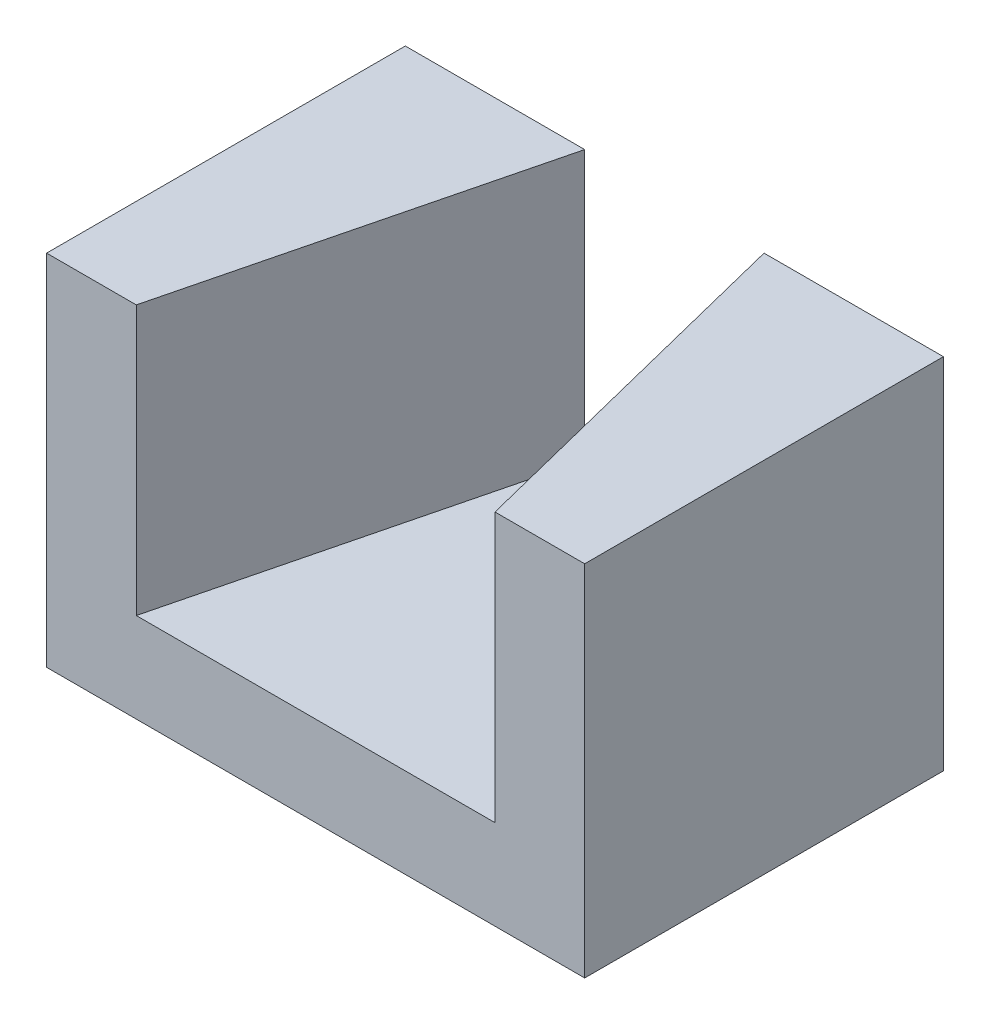
ISO-10303-21;
HEADER;
FILE_DESCRIPTION(('STEP AP214'),'2;1');
FILE_NAME('part.step','',(''),(''),'','','');
FILE_SCHEMA(('AUTOMOTIVE_DESIGN { 1 0 10303 214 1 1 1 1 }'));
ENDSEC;
DATA;
#1=APPLICATION_CONTEXT('core data for automotive mechanical design processes');
#2=APPLICATION_PROTOCOL_DEFINITION('international standard','automotive_design',2000,#1);
#3=PRODUCT_CONTEXT('',#1,'mechanical');
#4=PRODUCT('Part','Part','',(#3));
#5=PRODUCT_RELATED_PRODUCT_CATEGORY('part','',(#4));
#6=PRODUCT_DEFINITION_FORMATION('','',#4);
#7=PRODUCT_DEFINITION_CONTEXT('part definition',#1,'design');
#8=PRODUCT_DEFINITION('design','',#6,#7);
#9=PRODUCT_DEFINITION_SHAPE('','',#8);
#10=(LENGTH_UNIT() NAMED_UNIT(*) SI_UNIT(.MILLI.,.METRE.));
#11=(NAMED_UNIT(*) PLANE_ANGLE_UNIT() SI_UNIT($,.RADIAN.));
#12=(NAMED_UNIT(*) SI_UNIT($,.STERADIAN.) SOLID_ANGLE_UNIT());
#13=UNCERTAINTY_MEASURE_WITH_UNIT(LENGTH_MEASURE(1.E-05),#10,'distance_accuracy_value','');
#14=(GEOMETRIC_REPRESENTATION_CONTEXT(3) GLOBAL_UNCERTAINTY_ASSIGNED_CONTEXT((#13)) GLOBAL_UNIT_ASSIGNED_CONTEXT((#10,
#11,#12)) REPRESENTATION_CONTEXT('',''));
#15=CARTESIAN_POINT('',(0.,0.,0.));
#16=DIRECTION('',(0.,0.,1.));
#17=DIRECTION('',(1.,0.,0.));
#18=AXIS2_PLACEMENT_3D('',#15,#16,#17);
#19=CARTESIAN_POINT('',(0.,40.,0.));
#20=DIRECTION('',(0.,1.,0.));
#21=DIRECTION('',(0.,0.,1.));
#22=AXIS2_PLACEMENT_3D('',#19,#20,#21);
#23=PLANE('',#22);
#24=DIRECTION('',(-0.242535625036333,0.,-0.970142500145332));
#25=VECTOR('',#24,1.);
#26=CARTESIAN_POINT('',(10.,40.,-20.));
#27=LINE('',#26,#25);
#28=CARTESIAN_POINT('',(20.,40.,20.));
#29=VERTEX_POINT('',#28);
#30=CARTESIAN_POINT('',(10.,40.,-20.));
#31=VERTEX_POINT('',#30);
#32=EDGE_CURVE('E119',#29,#31,#27,.T.);
#33=ORIENTED_EDGE('',*,*,#32,.F.);
#34=DIRECTION('',(1.,0.,0.));
#35=VECTOR('',#34,1.);
#36=CARTESIAN_POINT('',(-30.,40.,20.));
#37=LINE('',#36,#35);
#38=CARTESIAN_POINT('',(30.,40.,20.));
#39=VERTEX_POINT('',#38);
#40=EDGE_CURVE('E64',#29,#39,#37,.T.);
#41=ORIENTED_EDGE('',*,*,#40,.T.);
#42=DIRECTION('',(0.,0.,-1.));
#43=VECTOR('',#42,1.);
#44=CARTESIAN_POINT('',(30.,40.,-20.));
#45=LINE('',#44,#43);
#46=CARTESIAN_POINT('',(30.,40.,-20.));
#47=VERTEX_POINT('',#46);
#48=EDGE_CURVE('E158',#39,#47,#45,.T.);
#49=ORIENTED_EDGE('',*,*,#48,.T.);
#50=DIRECTION('',(-1.,0.,0.));
#51=VECTOR('',#50,1.);
#52=CARTESIAN_POINT('',(-30.,40.,-20.));
#53=LINE('',#52,#51);
#54=EDGE_CURVE('E93',#47,#31,#53,.T.);
#55=ORIENTED_EDGE('',*,*,#54,.T.);
#56=EDGE_LOOP('',(#33,#41,#49,#55));
#57=FACE_BOUND('',#56,.T.);
#58=ADVANCED_FACE('F39',(#57),#23,.T.);
#59=CARTESIAN_POINT('',(30.,40.,-20.));
#60=DIRECTION('',(-1.,0.,0.));
#61=DIRECTION('',(0.,0.,1.));
#62=AXIS2_PLACEMENT_3D('',#59,#60,#61);
#63=PLANE('',#62);
#64=DIRECTION('',(0.,0.,-1.));
#65=VECTOR('',#64,1.);
#66=CARTESIAN_POINT('',(30.,0.,-20.));
#67=LINE('',#66,#65);
#68=CARTESIAN_POINT('',(30.,0.,20.));
#69=VERTEX_POINT('',#68);
#70=CARTESIAN_POINT('',(30.,0.,-20.));
#71=VERTEX_POINT('',#70);
#72=EDGE_CURVE('E151',#69,#71,#67,.T.);
#73=ORIENTED_EDGE('',*,*,#72,.T.);
#74=DIRECTION('',(0.,-1.,0.));
#75=VECTOR('',#74,1.);
#76=CARTESIAN_POINT('',(30.,40.,-20.));
#77=LINE('',#76,#75);
#78=EDGE_CURVE('E11',#47,#71,#77,.T.);
#79=ORIENTED_EDGE('',*,*,#78,.F.);
#80=ORIENTED_EDGE('',*,*,#48,.F.);
#81=DIRECTION('',(0.,-1.,0.));
#82=VECTOR('',#81,1.);
#83=CARTESIAN_POINT('',(30.,40.,20.));
#84=LINE('',#83,#82);
#85=EDGE_CURVE('E171',#39,#69,#84,.T.);
#86=ORIENTED_EDGE('',*,*,#85,.T.);
#87=EDGE_LOOP('',(#73,#79,#80,#86));
#88=FACE_BOUND('',#87,.T.);
#89=ADVANCED_FACE('F41',(#88),#63,.F.);
#90=CARTESIAN_POINT('',(-30.,40.,-20.));
#91=DIRECTION('',(0.,0.,1.));
#92=DIRECTION('',(1.,0.,0.));
#93=AXIS2_PLACEMENT_3D('',#90,#91,#92);
#94=PLANE('',#93);
#95=DIRECTION('',(-1.,0.,0.));
#96=VECTOR('',#95,1.);
#97=CARTESIAN_POINT('',(-10.,10.,-20.));
#98=LINE('',#97,#96);
#99=CARTESIAN_POINT('',(10.,10.,-20.));
#100=VERTEX_POINT('',#99);
#101=CARTESIAN_POINT('',(-10.,10.,-20.));
#102=VERTEX_POINT('',#101);
#103=EDGE_CURVE('E128',#100,#102,#98,.T.);
#104=ORIENTED_EDGE('',*,*,#103,.F.);
#105=DIRECTION('',(0.,1.,0.));
#106=VECTOR('',#105,1.);
#107=CARTESIAN_POINT('',(10.,10.,-20.));
#108=LINE('',#107,#106);
#109=EDGE_CURVE('E114',#100,#31,#108,.T.);
#110=ORIENTED_EDGE('',*,*,#109,.T.);
#111=ORIENTED_EDGE('',*,*,#54,.F.);
#112=ORIENTED_EDGE('',*,*,#78,.T.);
#113=DIRECTION('',(-1.,0.,0.));
#114=VECTOR('',#113,1.);
#115=CARTESIAN_POINT('',(-30.,0.,-20.));
#116=LINE('',#115,#114);
#117=CARTESIAN_POINT('',(-30.,0.,-20.));
#118=VERTEX_POINT('',#117);
#119=EDGE_CURVE('E175',#71,#118,#116,.T.);
#120=ORIENTED_EDGE('',*,*,#119,.T.);
#121=DIRECTION('',(0.,-1.,0.));
#122=VECTOR('',#121,1.);
#123=CARTESIAN_POINT('',(-30.,40.,-20.));
#124=LINE('',#123,#122);
#125=CARTESIAN_POINT('',(-30.,40.,-20.));
#126=VERTEX_POINT('',#125);
#127=EDGE_CURVE('E48',#126,#118,#124,.T.);
#128=ORIENTED_EDGE('',*,*,#127,.F.);
#129=CARTESIAN_POINT('',(-10.,40.,-20.));
#130=VERTEX_POINT('',#129);
#131=EDGE_CURVE('E161',#130,#126,#53,.T.);
#132=ORIENTED_EDGE('',*,*,#131,.F.);
#133=DIRECTION('',(0.,1.,0.));
#134=VECTOR('',#133,1.);
#135=CARTESIAN_POINT('',(-10.,10.,-20.));
#136=LINE('',#135,#134);
#137=EDGE_CURVE('E55',#102,#130,#136,.T.);
#138=ORIENTED_EDGE('',*,*,#137,.F.);
#139=EDGE_LOOP('',(#104,#110,#111,#112,#120,#128,#132,#138));
#140=FACE_BOUND('',#139,.T.);
#141=ADVANCED_FACE('F134',(#140),#94,.F.);
#142=CARTESIAN_POINT('',(-30.,40.,-20.));
#143=DIRECTION('',(1.,0.,0.));
#144=DIRECTION('',(0.,0.,-1.));
#145=AXIS2_PLACEMENT_3D('',#142,#143,#144);
#146=PLANE('',#145);
#147=DIRECTION('',(0.,0.,1.));
#148=VECTOR('',#147,1.);
#149=CARTESIAN_POINT('',(-30.,0.,-20.));
#150=LINE('',#149,#148);
#151=CARTESIAN_POINT('',(-30.,0.,20.));
#152=VERTEX_POINT('',#151);
#153=EDGE_CURVE('E178',#118,#152,#150,.T.);
#154=ORIENTED_EDGE('',*,*,#153,.T.);
#155=DIRECTION('',(0.,-1.,0.));
#156=VECTOR('',#155,1.);
#157=CARTESIAN_POINT('',(-30.,40.,20.));
#158=LINE('',#157,#156);
#159=CARTESIAN_POINT('',(-30.,40.,20.));
#160=VERTEX_POINT('',#159);
#161=EDGE_CURVE('E185',#160,#152,#158,.T.);
#162=ORIENTED_EDGE('',*,*,#161,.F.);
#163=DIRECTION('',(0.,0.,1.));
#164=VECTOR('',#163,1.);
#165=CARTESIAN_POINT('',(-30.,40.,-20.));
#166=LINE('',#165,#164);
#167=EDGE_CURVE('E164',#126,#160,#166,.T.);
#168=ORIENTED_EDGE('',*,*,#167,.F.);
#169=ORIENTED_EDGE('',*,*,#127,.T.);
#170=EDGE_LOOP('',(#154,#162,#168,#169));
#171=FACE_BOUND('',#170,.T.);
#172=ADVANCED_FACE('F193',(#171),#146,.F.);
#173=CARTESIAN_POINT('',(-30.,40.,20.));
#174=DIRECTION('',(0.,0.,-1.));
#175=DIRECTION('',(-1.,0.,0.));
#176=AXIS2_PLACEMENT_3D('',#173,#174,#175);
#177=PLANE('',#176);
#178=ORIENTED_EDGE('',*,*,#40,.F.);
#179=DIRECTION('',(0.,1.,0.));
#180=VECTOR('',#179,1.);
#181=CARTESIAN_POINT('',(20.,10.,20.));
#182=LINE('',#181,#180);
#183=CARTESIAN_POINT('',(20.,10.,20.));
#184=VERTEX_POINT('',#183);
#185=EDGE_CURVE('E148',#184,#29,#182,.T.);
#186=ORIENTED_EDGE('',*,*,#185,.F.);
#187=DIRECTION('',(1.,0.,0.));
#188=VECTOR('',#187,1.);
#189=CARTESIAN_POINT('',(-20.,10.,20.));
#190=LINE('',#189,#188);
#191=CARTESIAN_POINT('',(-20.,10.,20.));
#192=VERTEX_POINT('',#191);
#193=EDGE_CURVE('E122',#192,#184,#190,.T.);
#194=ORIENTED_EDGE('',*,*,#193,.F.);
#195=DIRECTION('',(0.,1.,0.));
#196=VECTOR('',#195,1.);
#197=CARTESIAN_POINT('',(-20.,10.,20.));
#198=LINE('',#197,#196);
#199=CARTESIAN_POINT('',(-20.,40.,20.));
#200=VERTEX_POINT('',#199);
#201=EDGE_CURVE('E152',#192,#200,#198,.T.);
#202=ORIENTED_EDGE('',*,*,#201,.T.);
#203=EDGE_CURVE('E167',#160,#200,#37,.T.);
#204=ORIENTED_EDGE('',*,*,#203,.F.);
#205=ORIENTED_EDGE('',*,*,#161,.T.);
#206=DIRECTION('',(1.,0.,0.));
#207=VECTOR('',#206,1.);
#208=CARTESIAN_POINT('',(-30.,0.,20.));
#209=LINE('',#208,#207);
#210=EDGE_CURVE('E86',#152,#69,#209,.T.);
#211=ORIENTED_EDGE('',*,*,#210,.T.);
#212=ORIENTED_EDGE('',*,*,#85,.F.);
#213=EDGE_LOOP('',(#178,#186,#194,#202,#204,#205,#211,#212));
#214=FACE_BOUND('',#213,.T.);
#215=ADVANCED_FACE('F201',(#214),#177,.F.);
#216=DIRECTION('',(-0.242535625036333,0.,0.970142500145332));
#217=VECTOR('',#216,1.);
#218=CARTESIAN_POINT('',(-10.,40.,-20.));
#219=LINE('',#218,#217);
#220=EDGE_CURVE('E132',#130,#200,#219,.T.);
#221=ORIENTED_EDGE('',*,*,#220,.F.);
#222=ORIENTED_EDGE('',*,*,#131,.T.);
#223=ORIENTED_EDGE('',*,*,#167,.T.);
#224=ORIENTED_EDGE('',*,*,#203,.T.);
#225=EDGE_LOOP('',(#221,#222,#223,#224));
#226=FACE_BOUND('',#225,.T.);
#227=ADVANCED_FACE('F205',(#226),#23,.T.);
#228=CARTESIAN_POINT('',(0.,0.,0.));
#229=DIRECTION('',(0.,1.,0.));
#230=DIRECTION('',(0.,0.,1.));
#231=AXIS2_PLACEMENT_3D('',#228,#229,#230);
#232=PLANE('',#231);
#233=ORIENTED_EDGE('',*,*,#72,.F.);
#234=ORIENTED_EDGE('',*,*,#210,.F.);
#235=ORIENTED_EDGE('',*,*,#153,.F.);
#236=ORIENTED_EDGE('',*,*,#119,.F.);
#237=EDGE_LOOP('',(#233,#234,#235,#236));
#238=FACE_BOUND('',#237,.T.);
#239=ADVANCED_FACE('F197',(#238),#232,.F.);
#240=CARTESIAN_POINT('',(10.,10.,-20.));
#241=DIRECTION('',(0.970142500145332,0.,-0.242535625036333));
#242=DIRECTION('',(-0.242535625036333,0.,-0.970142500145332));
#243=AXIS2_PLACEMENT_3D('',#240,#241,#242);
#244=PLANE('',#243);
#245=ORIENTED_EDGE('',*,*,#32,.T.);
#246=ORIENTED_EDGE('',*,*,#109,.F.);
#247=DIRECTION('',(-0.242535625036333,0.,-0.970142500145332));
#248=VECTOR('',#247,1.);
#249=CARTESIAN_POINT('',(10.,10.,-20.));
#250=LINE('',#249,#248);
#251=EDGE_CURVE('E117',#184,#100,#250,.T.);
#252=ORIENTED_EDGE('',*,*,#251,.F.);
#253=ORIENTED_EDGE('',*,*,#185,.T.);
#254=EDGE_LOOP('',(#245,#246,#252,#253));
#255=FACE_BOUND('',#254,.T.);
#256=ADVANCED_FACE('F116',(#255),#244,.F.);
#257=CARTESIAN_POINT('',(-10.,10.,-20.));
#258=DIRECTION('',(-0.970142500145332,0.,-0.242535625036333));
#259=DIRECTION('',(-0.242535625036333,0.,0.970142500145332));
#260=AXIS2_PLACEMENT_3D('',#257,#258,#259);
#261=PLANE('',#260);
#262=ORIENTED_EDGE('',*,*,#220,.T.);
#263=ORIENTED_EDGE('',*,*,#201,.F.);
#264=DIRECTION('',(-0.242535625036333,0.,0.970142500145332));
#265=VECTOR('',#264,1.);
#266=CARTESIAN_POINT('',(-10.,10.,-20.));
#267=LINE('',#266,#265);
#268=EDGE_CURVE('E137',#102,#192,#267,.T.);
#269=ORIENTED_EDGE('',*,*,#268,.F.);
#270=ORIENTED_EDGE('',*,*,#137,.T.);
#271=EDGE_LOOP('',(#262,#263,#269,#270));
#272=FACE_BOUND('',#271,.T.);
#273=ADVANCED_FACE('F207',(#272),#261,.F.);
#274=CARTESIAN_POINT('',(0.,10.,0.));
#275=DIRECTION('',(0.,1.,0.));
#276=DIRECTION('',(0.,0.,1.));
#277=AXIS2_PLACEMENT_3D('',#274,#275,#276);
#278=PLANE('',#277);
#279=ORIENTED_EDGE('',*,*,#251,.T.);
#280=ORIENTED_EDGE('',*,*,#103,.T.);
#281=ORIENTED_EDGE('',*,*,#268,.T.);
#282=ORIENTED_EDGE('',*,*,#193,.T.);
#283=EDGE_LOOP('',(#279,#280,#281,#282));
#284=FACE_BOUND('',#283,.T.);
#285=ADVANCED_FACE('F126',(#284),#278,.T.);
#286=CLOSED_SHELL('',(#58,#89,#141,#172,#215,#227,#239,#256,#273,#285));
#287=MANIFOLD_SOLID_BREP('B2',#286);
#288=ADVANCED_BREP_SHAPE_REPRESENTATION('',(#18,#287),#14);
#289=SHAPE_DEFINITION_REPRESENTATION(#9,#288);
ENDSEC;
END-ISO-10303-21;
